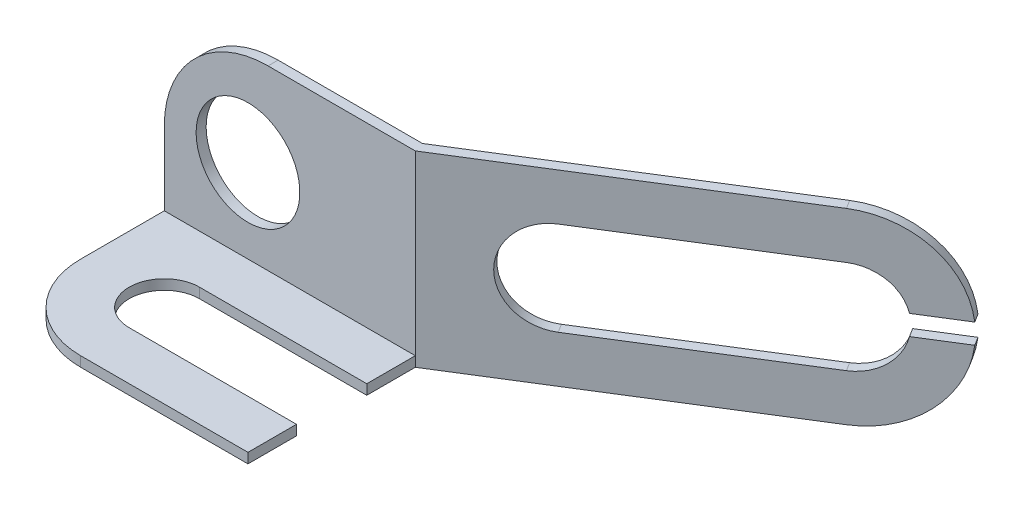
ISO-10303-21;
HEADER;
FILE_DESCRIPTION(('STEP AP214'),'2;1');
FILE_NAME('part.step','',(''),(''),'','','');
FILE_SCHEMA(('AUTOMOTIVE_DESIGN { 1 0 10303 214 1 1 1 1 }'));
ENDSEC;
DATA;
#1=APPLICATION_CONTEXT('core data for automotive mechanical design processes');
#2=APPLICATION_PROTOCOL_DEFINITION('international standard','automotive_design',2000,#1);
#3=PRODUCT_CONTEXT('',#1,'mechanical');
#4=PRODUCT('Part','Part','',(#3));
#5=PRODUCT_RELATED_PRODUCT_CATEGORY('part','',(#4));
#6=PRODUCT_DEFINITION_FORMATION('','',#4);
#7=PRODUCT_DEFINITION_CONTEXT('part definition',#1,'design');
#8=PRODUCT_DEFINITION('design','',#6,#7);
#9=PRODUCT_DEFINITION_SHAPE('','',#8);
#10=(LENGTH_UNIT() NAMED_UNIT(*) SI_UNIT(.MILLI.,.METRE.));
#11=(NAMED_UNIT(*) PLANE_ANGLE_UNIT() SI_UNIT($,.RADIAN.));
#12=(NAMED_UNIT(*) SI_UNIT($,.STERADIAN.) SOLID_ANGLE_UNIT());
#13=UNCERTAINTY_MEASURE_WITH_UNIT(LENGTH_MEASURE(1.E-05),#10,'distance_accuracy_value','');
#14=(GEOMETRIC_REPRESENTATION_CONTEXT(3) GLOBAL_UNCERTAINTY_ASSIGNED_CONTEXT((#13)) GLOBAL_UNIT_ASSIGNED_CONTEXT((#10,
#11,#12)) REPRESENTATION_CONTEXT('',''));
#15=CARTESIAN_POINT('',(0.,0.,0.));
#16=DIRECTION('',(0.,0.,1.));
#17=DIRECTION('',(1.,0.,0.));
#18=AXIS2_PLACEMENT_3D('',#15,#16,#17);
#19=CARTESIAN_POINT('',(0.75,0.06,-0.5));
#20=DIRECTION('',(-1.,0.,0.));
#21=DIRECTION('',(0.,0.,1.));
#22=AXIS2_PLACEMENT_3D('',#19,#20,#21);
#23=PLANE('',#22);
#24=DIRECTION('',(0.,1.,0.));
#25=VECTOR('',#24,1.);
#26=CARTESIAN_POINT('',(0.75,1.12,-0.5));
#27=LINE('',#26,#25);
#28=CARTESIAN_POINT('',(0.75,0.,-0.5));
#29=VERTEX_POINT('',#28);
#30=CARTESIAN_POINT('',(0.75,0.0599999999999999,-0.5));
#31=VERTEX_POINT('',#30);
#32=EDGE_CURVE('E233',#29,#31,#27,.T.);
#33=ORIENTED_EDGE('',*,*,#32,.T.);
#34=DIRECTION('',(0.,0.,-1.));
#35=VECTOR('',#34,1.);
#36=CARTESIAN_POINT('',(0.75,0.06,-0.5));
#37=LINE('',#36,#35);
#38=CARTESIAN_POINT('',(0.75,0.06,-0.21));
#39=VERTEX_POINT('',#38);
#40=EDGE_CURVE('E320',#39,#31,#37,.T.);
#41=ORIENTED_EDGE('',*,*,#40,.F.);
#42=DIRECTION('',(0.,-1.,0.));
#43=VECTOR('',#42,1.);
#44=CARTESIAN_POINT('',(0.75,0.06,-0.21));
#45=LINE('',#44,#43);
#46=CARTESIAN_POINT('',(0.75,0.,-0.21));
#47=VERTEX_POINT('',#46);
#48=EDGE_CURVE('E354',#39,#47,#45,.T.);
#49=ORIENTED_EDGE('',*,*,#48,.T.);
#50=DIRECTION('',(0.,0.,-1.));
#51=VECTOR('',#50,1.);
#52=CARTESIAN_POINT('',(0.75,0.,-0.5));
#53=LINE('',#52,#51);
#54=EDGE_CURVE('E51',#47,#29,#53,.T.);
#55=ORIENTED_EDGE('',*,*,#54,.T.);
#56=EDGE_LOOP('',(#33,#41,#49,#55));
#57=FACE_BOUND('',#56,.T.);
#58=ADVANCED_FACE('F36',(#57),#23,.F.);
#59=CARTESIAN_POINT('',(0.75,0.06,0.21));
#60=DIRECTION('',(-1.,0.,0.));
#61=DIRECTION('',(0.,0.,1.));
#62=AXIS2_PLACEMENT_3D('',#59,#60,#61);
#63=PLANE('',#62);
#64=DIRECTION('',(0.,0.,-1.));
#65=VECTOR('',#64,1.);
#66=CARTESIAN_POINT('',(0.75,0.,0.21));
#67=LINE('',#66,#65);
#68=CARTESIAN_POINT('',(0.75,0.,0.5));
#69=VERTEX_POINT('',#68);
#70=CARTESIAN_POINT('',(0.75,0.,0.21));
#71=VERTEX_POINT('',#70);
#72=EDGE_CURVE('E309',#69,#71,#67,.T.);
#73=ORIENTED_EDGE('',*,*,#72,.T.);
#74=DIRECTION('',(0.,-1.,0.));
#75=VECTOR('',#74,1.);
#76=CARTESIAN_POINT('',(0.75,0.06,0.21));
#77=LINE('',#76,#75);
#78=CARTESIAN_POINT('',(0.75,0.06,0.21));
#79=VERTEX_POINT('',#78);
#80=EDGE_CURVE('E11',#79,#71,#77,.T.);
#81=ORIENTED_EDGE('',*,*,#80,.F.);
#82=DIRECTION('',(0.,0.,-1.));
#83=VECTOR('',#82,1.);
#84=CARTESIAN_POINT('',(0.75,0.06,0.21));
#85=LINE('',#84,#83);
#86=CARTESIAN_POINT('',(0.75,0.06,0.5));
#87=VERTEX_POINT('',#86);
#88=EDGE_CURVE('E310',#87,#79,#85,.T.);
#89=ORIENTED_EDGE('',*,*,#88,.F.);
#90=DIRECTION('',(0.,-1.,0.));
#91=VECTOR('',#90,1.);
#92=CARTESIAN_POINT('',(0.75,0.06,0.5));
#93=LINE('',#92,#91);
#94=EDGE_CURVE('E331',#87,#69,#93,.T.);
#95=ORIENTED_EDGE('',*,*,#94,.T.);
#96=EDGE_LOOP('',(#73,#81,#89,#95));
#97=FACE_BOUND('',#96,.T.);
#98=ADVANCED_FACE('F38',(#97),#63,.F.);
#99=CARTESIAN_POINT('',(-0.25,0.06,0.21));
#100=DIRECTION('',(0.,0.,1.));
#101=DIRECTION('',(1.,0.,0.));
#102=AXIS2_PLACEMENT_3D('',#99,#100,#101);
#103=PLANE('',#102);
#104=DIRECTION('',(-1.,0.,0.));
#105=VECTOR('',#104,1.);
#106=CARTESIAN_POINT('',(-0.25,0.,0.21));
#107=LINE('',#106,#105);
#108=CARTESIAN_POINT('',(-0.25,0.,0.21));
#109=VERTEX_POINT('',#108);
#110=EDGE_CURVE('E334',#71,#109,#107,.T.);
#111=ORIENTED_EDGE('',*,*,#110,.T.);
#112=DIRECTION('',(0.,-1.,0.));
#113=VECTOR('',#112,1.);
#114=CARTESIAN_POINT('',(-0.25,0.06,0.21));
#115=LINE('',#114,#113);
#116=CARTESIAN_POINT('',(-0.25,0.06,0.21));
#117=VERTEX_POINT('',#116);
#118=EDGE_CURVE('E44',#117,#109,#115,.T.);
#119=ORIENTED_EDGE('',*,*,#118,.F.);
#120=DIRECTION('',(-1.,0.,0.));
#121=VECTOR('',#120,1.);
#122=CARTESIAN_POINT('',(-0.25,0.06,0.21));
#123=LINE('',#122,#121);
#124=EDGE_CURVE('E313',#79,#117,#123,.T.);
#125=ORIENTED_EDGE('',*,*,#124,.F.);
#126=ORIENTED_EDGE('',*,*,#80,.T.);
#127=EDGE_LOOP('',(#111,#119,#125,#126));
#128=FACE_BOUND('',#127,.T.);
#129=ADVANCED_FACE('F411',(#128),#103,.F.);
#130=CARTESIAN_POINT('',(-0.25,0.06,0.));
#131=DIRECTION('',(0.,-1.,0.));
#132=DIRECTION('',(0.,0.,-1.));
#133=AXIS2_PLACEMENT_3D('',#130,#131,#132);
#134=CYLINDRICAL_SURFACE('',#133,0.21);
#135=CARTESIAN_POINT('',(-0.25,0.,0.));
#136=DIRECTION('',(0.,-1.,0.));
#137=DIRECTION('',(0.,0.,1.));
#138=AXIS2_PLACEMENT_3D('',#135,#136,#137);
#139=CIRCLE('',#138,0.21);
#140=CARTESIAN_POINT('',(-0.25,0.,-0.21));
#141=VERTEX_POINT('',#140);
#142=EDGE_CURVE('E336',#109,#141,#139,.T.);
#143=ORIENTED_EDGE('',*,*,#142,.T.);
#144=DIRECTION('',(0.,-1.,0.));
#145=VECTOR('',#144,1.);
#146=CARTESIAN_POINT('',(-0.25,0.06,-0.21));
#147=LINE('',#146,#145);
#148=CARTESIAN_POINT('',(-0.25,0.06,-0.21));
#149=VERTEX_POINT('',#148);
#150=EDGE_CURVE('E356',#149,#141,#147,.T.);
#151=ORIENTED_EDGE('',*,*,#150,.F.);
#152=CARTESIAN_POINT('',(-0.25,0.06,0.));
#153=DIRECTION('',(0.,-1.,0.));
#154=DIRECTION('',(0.,0.,1.));
#155=AXIS2_PLACEMENT_3D('',#152,#153,#154);
#156=CIRCLE('',#155,0.21);
#157=EDGE_CURVE('E316',#117,#149,#156,.T.);
#158=ORIENTED_EDGE('',*,*,#157,.F.);
#159=ORIENTED_EDGE('',*,*,#118,.T.);
#160=EDGE_LOOP('',(#143,#151,#158,#159));
#161=FACE_BOUND('',#160,.T.);
#162=ADVANCED_FACE('F363',(#161),#134,.F.);
#163=CARTESIAN_POINT('',(-0.25,0.06,-0.21));
#164=DIRECTION('',(0.,0.,-1.));
#165=DIRECTION('',(-1.,0.,0.));
#166=AXIS2_PLACEMENT_3D('',#163,#164,#165);
#167=PLANE('',#166);
#168=DIRECTION('',(1.,0.,0.));
#169=VECTOR('',#168,1.);
#170=CARTESIAN_POINT('',(-0.25,0.,-0.21));
#171=LINE('',#170,#169);
#172=EDGE_CURVE('E338',#141,#47,#171,.T.);
#173=ORIENTED_EDGE('',*,*,#172,.T.);
#174=ORIENTED_EDGE('',*,*,#48,.F.);
#175=DIRECTION('',(1.,0.,0.));
#176=VECTOR('',#175,1.);
#177=CARTESIAN_POINT('',(-0.25,0.06,-0.21));
#178=LINE('',#177,#176);
#179=EDGE_CURVE('E318',#149,#39,#178,.T.);
#180=ORIENTED_EDGE('',*,*,#179,.F.);
#181=ORIENTED_EDGE('',*,*,#150,.T.);
#182=EDGE_LOOP('',(#173,#174,#180,#181));
#183=FACE_BOUND('',#182,.T.);
#184=ADVANCED_FACE('F372',(#183),#167,.F.);
#185=CARTESIAN_POINT('',(-0.75,0.06,-0.5));
#186=DIRECTION('',(1.,0.,0.));
#187=DIRECTION('',(0.,0.,-1.));
#188=AXIS2_PLACEMENT_3D('',#185,#186,#187);
#189=PLANE('',#188);
#190=DIRECTION('',(0.,0.,1.));
#191=VECTOR('',#190,1.);
#192=CARTESIAN_POINT('',(-0.75,0.,-0.5));
#193=LINE('',#192,#191);
#194=CARTESIAN_POINT('',(-0.75,0.,-0.56));
#195=VERTEX_POINT('',#194);
#196=CARTESIAN_POINT('',(-0.75,0.,0.));
#197=VERTEX_POINT('',#196);
#198=EDGE_CURVE('E341',#195,#197,#193,.T.);
#199=ORIENTED_EDGE('',*,*,#198,.T.);
#200=DIRECTION('',(0.,-1.,0.));
#201=VECTOR('',#200,1.);
#202=CARTESIAN_POINT('',(-0.75,0.06,0.));
#203=LINE('',#202,#201);
#204=CARTESIAN_POINT('',(-0.75,0.06,0.));
#205=VERTEX_POINT('',#204);
#206=EDGE_CURVE('E351',#205,#197,#203,.T.);
#207=ORIENTED_EDGE('',*,*,#206,.F.);
#208=DIRECTION('',(0.,0.,1.));
#209=VECTOR('',#208,1.);
#210=CARTESIAN_POINT('',(-0.75,0.06,-0.5));
#211=LINE('',#210,#209);
#212=CARTESIAN_POINT('',(-0.75,0.06,-0.5));
#213=VERTEX_POINT('',#212);
#214=EDGE_CURVE('E325',#213,#205,#211,.T.);
#215=ORIENTED_EDGE('',*,*,#214,.F.);
#216=DIRECTION('',(0.,1.,0.));
#217=VECTOR('',#216,1.);
#218=CARTESIAN_POINT('',(-0.75,0.,-0.5));
#219=LINE('',#218,#217);
#220=CARTESIAN_POINT('',(-0.75,0.499999999999996,-0.5));
#221=VERTEX_POINT('',#220);
#222=EDGE_CURVE('E299',#213,#221,#219,.T.);
#223=ORIENTED_EDGE('',*,*,#222,.T.);
#224=DIRECTION('',(0.,0.,1.));
#225=VECTOR('',#224,1.);
#226=CARTESIAN_POINT('',(-0.75,0.499999999999996,-0.56));
#227=LINE('',#226,#225);
#228=CARTESIAN_POINT('',(-0.75,0.499999999999996,-0.56));
#229=VERTEX_POINT('',#228);
#230=EDGE_CURVE('E306',#229,#221,#227,.T.);
#231=ORIENTED_EDGE('',*,*,#230,.F.);
#232=DIRECTION('',(0.,1.,0.));
#233=VECTOR('',#232,1.);
#234=CARTESIAN_POINT('',(-0.75,0.,-0.56));
#235=LINE('',#234,#233);
#236=EDGE_CURVE('E289',#195,#229,#235,.T.);
#237=ORIENTED_EDGE('',*,*,#236,.F.);
#238=EDGE_LOOP('',(#199,#207,#215,#223,#231,#237));
#239=FACE_BOUND('',#238,.T.);
#240=ADVANCED_FACE('F388',(#239),#189,.F.);
#241=CARTESIAN_POINT('',(-0.25,0.06,0.));
#242=DIRECTION('',(0.,-1.,0.));
#243=DIRECTION('',(0.,0.,-1.));
#244=AXIS2_PLACEMENT_3D('',#241,#242,#243);
#245=CYLINDRICAL_SURFACE('',#244,0.5);
#246=CARTESIAN_POINT('',(-0.25,0.,0.));
#247=DIRECTION('',(0.,1.,0.));
#248=DIRECTION('',(0.,0.,-1.));
#249=AXIS2_PLACEMENT_3D('',#246,#247,#248);
#250=CIRCLE('',#249,0.5);
#251=CARTESIAN_POINT('',(-0.249999999999997,0.,0.5));
#252=VERTEX_POINT('',#251);
#253=EDGE_CURVE('E343',#197,#252,#250,.T.);
#254=ORIENTED_EDGE('',*,*,#253,.T.);
#255=DIRECTION('',(0.,-1.,0.));
#256=VECTOR('',#255,1.);
#257=CARTESIAN_POINT('',(-0.249999999999997,0.06,0.5));
#258=LINE('',#257,#256);
#259=CARTESIAN_POINT('',(-0.249999999999997,0.06,0.5));
#260=VERTEX_POINT('',#259);
#261=EDGE_CURVE('E348',#260,#252,#258,.T.);
#262=ORIENTED_EDGE('',*,*,#261,.F.);
#263=CARTESIAN_POINT('',(-0.25,0.06,0.));
#264=DIRECTION('',(0.,1.,0.));
#265=DIRECTION('',(0.,0.,-1.));
#266=AXIS2_PLACEMENT_3D('',#263,#264,#265);
#267=CIRCLE('',#266,0.5);
#268=EDGE_CURVE('E327',#205,#260,#267,.T.);
#269=ORIENTED_EDGE('',*,*,#268,.F.);
#270=ORIENTED_EDGE('',*,*,#206,.T.);
#271=EDGE_LOOP('',(#254,#262,#269,#270));
#272=FACE_BOUND('',#271,.T.);
#273=ADVANCED_FACE('F401',(#272),#245,.T.);
#274=CARTESIAN_POINT('',(-0.249999999999997,0.06,0.5));
#275=DIRECTION('',(0.,0.,-1.));
#276=DIRECTION('',(-1.,0.,0.));
#277=AXIS2_PLACEMENT_3D('',#274,#275,#276);
#278=PLANE('',#277);
#279=DIRECTION('',(1.,0.,0.));
#280=VECTOR('',#279,1.);
#281=CARTESIAN_POINT('',(-0.249999999999997,0.,0.5));
#282=LINE('',#281,#280);
#283=EDGE_CURVE('E314',#252,#69,#282,.T.);
#284=ORIENTED_EDGE('',*,*,#283,.T.);
#285=ORIENTED_EDGE('',*,*,#94,.F.);
#286=DIRECTION('',(1.,0.,0.));
#287=VECTOR('',#286,1.);
#288=CARTESIAN_POINT('',(-0.249999999999997,0.06,0.5));
#289=LINE('',#288,#287);
#290=EDGE_CURVE('E329',#260,#87,#289,.T.);
#291=ORIENTED_EDGE('',*,*,#290,.F.);
#292=ORIENTED_EDGE('',*,*,#261,.T.);
#293=EDGE_LOOP('',(#284,#285,#291,#292));
#294=FACE_BOUND('',#293,.T.);
#295=ADVANCED_FACE('F406',(#294),#278,.F.);
#296=CARTESIAN_POINT('',(-0.25,0.06,0.));
#297=DIRECTION('',(0.,-1.,0.));
#298=DIRECTION('',(0.,0.,-1.));
#299=AXIS2_PLACEMENT_3D('',#296,#297,#298);
#300=PLANE('',#299);
#301=ORIENTED_EDGE('',*,*,#88,.T.);
#302=ORIENTED_EDGE('',*,*,#124,.T.);
#303=ORIENTED_EDGE('',*,*,#157,.T.);
#304=ORIENTED_EDGE('',*,*,#179,.T.);
#305=ORIENTED_EDGE('',*,*,#40,.T.);
#306=DIRECTION('',(-1.,0.,0.));
#307=VECTOR('',#306,1.);
#308=CARTESIAN_POINT('',(-0.75,0.06,-0.5));
#309=LINE('',#308,#307);
#310=EDGE_CURVE('E322',#31,#213,#309,.T.);
#311=ORIENTED_EDGE('',*,*,#310,.T.);
#312=ORIENTED_EDGE('',*,*,#214,.T.);
#313=ORIENTED_EDGE('',*,*,#268,.T.);
#314=ORIENTED_EDGE('',*,*,#290,.T.);
#315=EDGE_LOOP('',(#301,#302,#303,#304,#305,#311,#312,#313,#314));
#316=FACE_BOUND('',#315,.T.);
#317=ADVANCED_FACE('F378',(#316),#300,.F.);
#318=CARTESIAN_POINT('',(-0.25,0.,0.));
#319=DIRECTION('',(0.,-1.,0.));
#320=DIRECTION('',(0.,0.,-1.));
#321=AXIS2_PLACEMENT_3D('',#318,#319,#320);
#322=PLANE('',#321);
#323=DIRECTION('',(-0.848048096156425,0.,0.529919264233206));
#324=VECTOR('',#323,1.);
#325=CARTESIAN_POINT('',(0.75,0.,-0.5));
#326=LINE('',#325,#324);
#327=CARTESIAN_POINT('',(2.33584993981252,0.,-1.4909490241161));
#328=VERTEX_POINT('',#327);
#329=EDGE_CURVE('E198',#328,#29,#326,.T.);
#330=ORIENTED_EDGE('',*,*,#329,.T.);
#331=ORIENTED_EDGE('',*,*,#54,.F.);
#332=ORIENTED_EDGE('',*,*,#172,.F.);
#333=ORIENTED_EDGE('',*,*,#142,.F.);
#334=ORIENTED_EDGE('',*,*,#110,.F.);
#335=ORIENTED_EDGE('',*,*,#72,.F.);
#336=ORIENTED_EDGE('',*,*,#283,.F.);
#337=ORIENTED_EDGE('',*,*,#253,.F.);
#338=ORIENTED_EDGE('',*,*,#198,.F.);
#339=DIRECTION('',(-1.,0.,0.));
#340=VECTOR('',#339,1.);
#341=CARTESIAN_POINT('',(0.75,0.,-0.56));
#342=LINE('',#341,#340);
#343=CARTESIAN_POINT('',(0.732795276854471,0.,-0.56));
#344=VERTEX_POINT('',#343);
#345=EDGE_CURVE('E287',#344,#195,#342,.T.);
#346=ORIENTED_EDGE('',*,*,#345,.F.);
#347=DIRECTION('',(-0.848048096156425,0.,0.529919264233206));
#348=VECTOR('',#347,1.);
#349=CARTESIAN_POINT('',(0.718204844146007,0.,-0.550882885769386));
#350=LINE('',#349,#348);
#351=CARTESIAN_POINT('',(2.30405478395852,0.,-1.54183190988548));
#352=VERTEX_POINT('',#351);
#353=EDGE_CURVE('E230',#352,#344,#350,.T.);
#354=ORIENTED_EDGE('',*,*,#353,.F.);
#355=DIRECTION('',(0.529919264233206,0.,0.848048096156425));
#356=VECTOR('',#355,1.);
#357=CARTESIAN_POINT('',(2.30405478395852,0.,-1.54183190988548));
#358=LINE('',#357,#356);
#359=EDGE_CURVE('E232',#352,#328,#358,.T.);
#360=ORIENTED_EDGE('',*,*,#359,.T.);
#361=EDGE_LOOP('',(#330,#331,#332,#333,#334,#335,#336,#337,#338,#346,#354,#360));
#362=FACE_BOUND('',#361,.T.);
#363=ADVANCED_FACE('F368',(#362),#322,.T.);
#364=CARTESIAN_POINT('',(-0.13,0.5,-0.56));
#365=DIRECTION('',(0.,0.,-1.));
#366=DIRECTION('',(-1.,0.,0.));
#367=AXIS2_PLACEMENT_3D('',#364,#365,#366);
#368=PLANE('',#367);
#369=DIRECTION('',(0.,1.,0.));
#370=VECTOR('',#369,1.);
#371=CARTESIAN_POINT('',(0.732795276854471,0.5,-0.56));
#372=LINE('',#371,#370);
#373=CARTESIAN_POINT('',(0.732795276854471,1.12,-0.56));
#374=VERTEX_POINT('',#373);
#375=EDGE_CURVE('E59',#344,#374,#372,.T.);
#376=ORIENTED_EDGE('',*,*,#375,.F.);
#377=ORIENTED_EDGE('',*,*,#345,.T.);
#378=ORIENTED_EDGE('',*,*,#236,.T.);
#379=CARTESIAN_POINT('',(-0.13,0.5,-0.56));
#380=DIRECTION('',(0.,0.,-1.));
#381=DIRECTION('',(-1.,0.,0.));
#382=AXIS2_PLACEMENT_3D('',#379,#380,#381);
#383=CIRCLE('',#382,0.62);
#384=CARTESIAN_POINT('',(-0.129999999999996,1.12,-0.56));
#385=VERTEX_POINT('',#384);
#386=EDGE_CURVE('E292',#229,#385,#383,.T.);
#387=ORIENTED_EDGE('',*,*,#386,.T.);
#388=DIRECTION('',(1.,0.,0.));
#389=VECTOR('',#388,1.);
#390=CARTESIAN_POINT('',(0.75,1.12,-0.56));
#391=LINE('',#390,#389);
#392=EDGE_CURVE('E294',#385,#374,#391,.T.);
#393=ORIENTED_EDGE('',*,*,#392,.T.);
#394=EDGE_LOOP('',(#376,#377,#378,#387,#393));
#395=FACE_BOUND('',#394,.T.);
#396=CARTESIAN_POINT('',(-0.25,0.56,-0.56));
#397=DIRECTION('',(0.,0.,-1.));
#398=DIRECTION('',(-1.,0.,0.));
#399=AXIS2_PLACEMENT_3D('',#396,#397,#398);
#400=CIRCLE('',#399,0.31);
#401=CARTESIAN_POINT('',(-0.56,0.56,-0.56));
#402=VERTEX_POINT('',#401);
#403=EDGE_CURVE('E281',#402,#402,#400,.T.);
#404=ORIENTED_EDGE('',*,*,#403,.F.);
#405=EDGE_LOOP('',(#404));
#406=FACE_BOUND('',#405,.T.);
#407=ADVANCED_FACE('F395',(#395,#406),#368,.T.);
#408=CARTESIAN_POINT('',(-0.13,0.5,-0.5));
#409=DIRECTION('',(0.,0.,-1.));
#410=DIRECTION('',(-1.,0.,0.));
#411=AXIS2_PLACEMENT_3D('',#408,#409,#410);
#412=PLANE('',#411);
#413=ORIENTED_EDGE('',*,*,#310,.F.);
#414=DIRECTION('',(0.,-1.,0.));
#415=VECTOR('',#414,1.);
#416=CARTESIAN_POINT('',(0.75,0.,-0.5));
#417=LINE('',#416,#415);
#418=CARTESIAN_POINT('',(0.75,1.12,-0.5));
#419=VERTEX_POINT('',#418);
#420=EDGE_CURVE('E284',#419,#31,#417,.T.);
#421=ORIENTED_EDGE('',*,*,#420,.F.);
#422=DIRECTION('',(1.,0.,0.));
#423=VECTOR('',#422,1.);
#424=CARTESIAN_POINT('',(0.75,1.12,-0.5));
#425=LINE('',#424,#423);
#426=CARTESIAN_POINT('',(-0.129999999999996,1.12,-0.5));
#427=VERTEX_POINT('',#426);
#428=EDGE_CURVE('E290',#427,#419,#425,.T.);
#429=ORIENTED_EDGE('',*,*,#428,.F.);
#430=CARTESIAN_POINT('',(-0.13,0.5,-0.5));
#431=DIRECTION('',(0.,0.,-1.));
#432=DIRECTION('',(-1.,0.,0.));
#433=AXIS2_PLACEMENT_3D('',#430,#431,#432);
#434=CIRCLE('',#433,0.62);
#435=EDGE_CURVE('E301',#221,#427,#434,.T.);
#436=ORIENTED_EDGE('',*,*,#435,.F.);
#437=ORIENTED_EDGE('',*,*,#222,.F.);
#438=EDGE_LOOP('',(#413,#421,#429,#436,#437));
#439=FACE_BOUND('',#438,.T.);
#440=CARTESIAN_POINT('',(-0.25,0.56,-0.5));
#441=DIRECTION('',(0.,0.,-1.));
#442=DIRECTION('',(-1.,0.,0.));
#443=AXIS2_PLACEMENT_3D('',#440,#441,#442);
#444=CIRCLE('',#443,0.31);
#445=CARTESIAN_POINT('',(-0.56,0.56,-0.5));
#446=VERTEX_POINT('',#445);
#447=EDGE_CURVE('E280',#446,#446,#444,.T.);
#448=ORIENTED_EDGE('',*,*,#447,.T.);
#449=EDGE_LOOP('',(#448));
#450=FACE_BOUND('',#449,.T.);
#451=ADVANCED_FACE('F382',(#439,#450),#412,.F.);
#452=CARTESIAN_POINT('',(-0.13,0.5,-0.56));
#453=DIRECTION('',(0.,0.,1.));
#454=DIRECTION('',(1.,0.,0.));
#455=AXIS2_PLACEMENT_3D('',#452,#453,#454);
#456=CYLINDRICAL_SURFACE('',#455,0.62);
#457=ORIENTED_EDGE('',*,*,#435,.T.);
#458=DIRECTION('',(0.,0.,1.));
#459=VECTOR('',#458,1.);
#460=CARTESIAN_POINT('',(-0.129999999999996,1.12,-0.56));
#461=LINE('',#460,#459);
#462=EDGE_CURVE('E296',#385,#427,#461,.T.);
#463=ORIENTED_EDGE('',*,*,#462,.F.);
#464=ORIENTED_EDGE('',*,*,#386,.F.);
#465=ORIENTED_EDGE('',*,*,#230,.T.);
#466=EDGE_LOOP('',(#457,#463,#464,#465));
#467=FACE_BOUND('',#466,.T.);
#468=ADVANCED_FACE('F393',(#467),#456,.T.);
#469=CARTESIAN_POINT('',(0.75,1.12,-0.56));
#470=DIRECTION('',(0.,-1.,0.));
#471=DIRECTION('',(0.,0.,-1.));
#472=AXIS2_PLACEMENT_3D('',#469,#470,#471);
#473=PLANE('',#472);
#474=ORIENTED_EDGE('',*,*,#428,.T.);
#475=DIRECTION('',(0.848048096156425,0.,-0.529919264233206));
#476=VECTOR('',#475,1.);
#477=CARTESIAN_POINT('',(0.75,1.12,-0.5));
#478=LINE('',#477,#476);
#479=CARTESIAN_POINT('',(2.33584993981252,1.12,-1.4909490241161));
#480=VERTEX_POINT('',#479);
#481=EDGE_CURVE('E204',#419,#480,#478,.T.);
#482=ORIENTED_EDGE('',*,*,#481,.T.);
#483=DIRECTION('',(0.529919264233206,0.,0.848048096156425));
#484=VECTOR('',#483,1.);
#485=CARTESIAN_POINT('',(2.30405478395852,1.12,-1.54183190988548));
#486=LINE('',#485,#484);
#487=CARTESIAN_POINT('',(2.30405478395852,1.12,-1.54183190988548));
#488=VERTEX_POINT('',#487);
#489=EDGE_CURVE('E201',#488,#480,#486,.T.);
#490=ORIENTED_EDGE('',*,*,#489,.F.);
#491=DIRECTION('',(0.848048096156425,0.,-0.529919264233206));
#492=VECTOR('',#491,1.);
#493=CARTESIAN_POINT('',(0.718204844146007,1.12,-0.550882885769386));
#494=LINE('',#493,#492);
#495=EDGE_CURVE('E189',#374,#488,#494,.T.);
#496=ORIENTED_EDGE('',*,*,#495,.F.);
#497=ORIENTED_EDGE('',*,*,#392,.F.);
#498=ORIENTED_EDGE('',*,*,#462,.T.);
#499=EDGE_LOOP('',(#474,#482,#490,#496,#497,#498));
#500=FACE_BOUND('',#499,.T.);
#501=ADVANCED_FACE('F202',(#500),#473,.F.);
#502=CARTESIAN_POINT('',(-0.25,0.56,-0.56));
#503=DIRECTION('',(0.,0.,1.));
#504=DIRECTION('',(1.,0.,0.));
#505=AXIS2_PLACEMENT_3D('',#502,#503,#504);
#506=CYLINDRICAL_SURFACE('',#505,0.31);
#507=ORIENTED_EDGE('',*,*,#403,.T.);
#508=EDGE_LOOP('',(#507));
#509=FACE_BOUND('',#508,.T.);
#510=ORIENTED_EDGE('',*,*,#447,.F.);
#511=EDGE_LOOP('',(#510));
#512=FACE_BOUND('',#511,.T.);
#513=ADVANCED_FACE('F445',(#509,#512),#506,.F.);
#514=CARTESIAN_POINT('',(2.30405478395852,0.56,-1.54183190988548));
#515=DIRECTION('',(0.529919264233206,0.,0.848048096156425));
#516=DIRECTION('',(0.848048096156425,0.,-0.529919264233206));
#517=AXIS2_PLACEMENT_3D('',#514,#515,#516);
#518=CYLINDRICAL_SURFACE('',#517,0.56);
#519=CARTESIAN_POINT('',(2.33584993981252,0.56,-1.4909490241161));
#520=DIRECTION('',(-0.529919264233206,0.,-0.848048096156425));
#521=DIRECTION('',(-0.848048096156425,0.,0.529919264233206));
#522=AXIS2_PLACEMENT_3D('',#519,#520,#521);
#523=CIRCLE('',#522,0.56);
#524=CARTESIAN_POINT('',(2.80802313658707,0.62,-1.78599558357357));
#525=VERTEX_POINT('',#524);
#526=EDGE_CURVE('E236',#480,#525,#523,.T.);
#527=ORIENTED_EDGE('',*,*,#526,.T.);
#528=DIRECTION('',(0.529919264233206,0.,0.848048096156425));
#529=VECTOR('',#528,1.);
#530=CARTESIAN_POINT('',(2.77622798073308,0.62,-1.83687846934296));
#531=LINE('',#530,#529);
#532=CARTESIAN_POINT('',(2.77622798073308,0.62,-1.83687846934296));
#533=VERTEX_POINT('',#532);
#534=EDGE_CURVE('E207',#533,#525,#531,.T.);
#535=ORIENTED_EDGE('',*,*,#534,.F.);
#536=CARTESIAN_POINT('',(2.30405478395852,0.56,-1.54183190988548));
#537=DIRECTION('',(-0.529919264233206,0.,-0.848048096156425));
#538=DIRECTION('',(-0.848048096156425,0.,0.529919264233206));
#539=AXIS2_PLACEMENT_3D('',#536,#537,#538);
#540=CIRCLE('',#539,0.56);
#541=EDGE_CURVE('E194',#488,#533,#540,.T.);
#542=ORIENTED_EDGE('',*,*,#541,.F.);
#543=ORIENTED_EDGE('',*,*,#489,.T.);
#544=EDGE_LOOP('',(#527,#535,#542,#543));
#545=FACE_BOUND('',#544,.T.);
#546=ADVANCED_FACE('F209',(#545),#518,.T.);
#547=CARTESIAN_POINT('',(2.53599244991623,0.62,-1.68676264889584));
#548=DIRECTION('',(0.,1.,0.));
#549=DIRECTION('',(-1.,0.,0.));
#550=AXIS2_PLACEMENT_3D('',#547,#548,#549);
#551=PLANE('',#550);
#552=DIRECTION('',(-0.848048096156426,0.,0.529919264233205));
#553=VECTOR('',#552,1.);
#554=CARTESIAN_POINT('',(2.56778760577023,0.62,-1.63587976312645));
#555=LINE('',#554,#553);
#556=CARTESIAN_POINT('',(2.56778760577023,0.62,-1.63587976312645));
#557=VERTEX_POINT('',#556);
#558=EDGE_CURVE('E238',#525,#557,#555,.T.);
#559=ORIENTED_EDGE('',*,*,#558,.T.);
#560=DIRECTION('',(0.529919264233206,0.,0.848048096156425));
#561=VECTOR('',#560,1.);
#562=CARTESIAN_POINT('',(2.53599244991623,0.62,-1.68676264889584));
#563=LINE('',#562,#561);
#564=CARTESIAN_POINT('',(2.53599244991623,0.62,-1.68676264889584));
#565=VERTEX_POINT('',#564);
#566=EDGE_CURVE('E275',#565,#557,#563,.T.);
#567=ORIENTED_EDGE('',*,*,#566,.F.);
#568=DIRECTION('',(-0.848048096156426,0.,0.529919264233205));
#569=VECTOR('',#568,1.);
#570=CARTESIAN_POINT('',(2.53599244991623,0.62,-1.68676264889584));
#571=LINE('',#570,#569);
#572=EDGE_CURVE('E212',#533,#565,#571,.T.);
#573=ORIENTED_EDGE('',*,*,#572,.F.);
#574=ORIENTED_EDGE('',*,*,#534,.T.);
#575=EDGE_LOOP('',(#559,#567,#573,#574));
#576=FACE_BOUND('',#575,.T.);
#577=ADVANCED_FACE('F455',(#576),#551,.F.);
#578=CARTESIAN_POINT('',(2.30405478395852,0.56,-1.54183190988548));
#579=DIRECTION('',(0.529919264233206,0.,0.848048096156425));
#580=DIRECTION('',(0.848048096156425,0.,-0.529919264233206));
#581=AXIS2_PLACEMENT_3D('',#578,#579,#580);
#582=CYLINDRICAL_SURFACE('',#581,0.28);
#583=CARTESIAN_POINT('',(2.33584993981252,0.56,-1.4909490241161));
#584=DIRECTION('',(0.529919264233206,0.,0.848048096156425));
#585=DIRECTION('',(-0.848048096156425,0.,0.529919264233206));
#586=AXIS2_PLACEMENT_3D('',#583,#584,#585);
#587=CIRCLE('',#586,0.28);
#588=CARTESIAN_POINT('',(2.33584993981252,0.84,-1.4909490241161));
#589=VERTEX_POINT('',#588);
#590=EDGE_CURVE('E240',#557,#589,#587,.T.);
#591=ORIENTED_EDGE('',*,*,#590,.T.);
#592=DIRECTION('',(0.529919264233206,0.,0.848048096156425));
#593=VECTOR('',#592,1.);
#594=CARTESIAN_POINT('',(2.30405478395852,0.84,-1.54183190988548));
#595=LINE('',#594,#593);
#596=CARTESIAN_POINT('',(2.30405478395852,0.84,-1.54183190988548));
#597=VERTEX_POINT('',#596);
#598=EDGE_CURVE('E272',#597,#589,#595,.T.);
#599=ORIENTED_EDGE('',*,*,#598,.F.);
#600=CARTESIAN_POINT('',(2.30405478395852,0.56,-1.54183190988548));
#601=DIRECTION('',(0.529919264233206,0.,0.848048096156425));
#602=DIRECTION('',(-0.848048096156425,0.,0.529919264233206));
#603=AXIS2_PLACEMENT_3D('',#600,#601,#602);
#604=CIRCLE('',#603,0.28);
#605=EDGE_CURVE('E214',#565,#597,#604,.T.);
#606=ORIENTED_EDGE('',*,*,#605,.F.);
#607=ORIENTED_EDGE('',*,*,#566,.T.);
#608=EDGE_LOOP('',(#591,#599,#606,#607));
#609=FACE_BOUND('',#608,.T.);
#610=ADVANCED_FACE('F458',(#609),#582,.F.);
#611=CARTESIAN_POINT('',(1.24399466376299,0.84,-0.879432829593974));
#612=DIRECTION('',(0.,1.,0.));
#613=DIRECTION('',(-1.,0.,0.));
#614=AXIS2_PLACEMENT_3D('',#611,#612,#613);
#615=PLANE('',#614);
#616=DIRECTION('',(-0.848048096156425,0.,0.529919264233206));
#617=VECTOR('',#616,1.);
#618=CARTESIAN_POINT('',(1.27578981961698,0.84,-0.828549943824588));
#619=LINE('',#618,#617);
#620=CARTESIAN_POINT('',(1.27578981961698,0.84,-0.828549943824588));
#621=VERTEX_POINT('',#620);
#622=EDGE_CURVE('E242',#589,#621,#619,.T.);
#623=ORIENTED_EDGE('',*,*,#622,.T.);
#624=DIRECTION('',(0.529919264233206,0.,0.848048096156425));
#625=VECTOR('',#624,1.);
#626=CARTESIAN_POINT('',(1.24399466376299,0.84,-0.879432829593974));
#627=LINE('',#626,#625);
#628=CARTESIAN_POINT('',(1.24399466376299,0.84,-0.879432829593974));
#629=VERTEX_POINT('',#628);
#630=EDGE_CURVE('E269',#629,#621,#627,.T.);
#631=ORIENTED_EDGE('',*,*,#630,.F.);
#632=DIRECTION('',(-0.848048096156425,0.,0.529919264233206));
#633=VECTOR('',#632,1.);
#634=CARTESIAN_POINT('',(1.24399466376299,0.84,-0.879432829593974));
#635=LINE('',#634,#633);
#636=EDGE_CURVE('E218',#597,#629,#635,.T.);
#637=ORIENTED_EDGE('',*,*,#636,.F.);
#638=ORIENTED_EDGE('',*,*,#598,.T.);
#639=EDGE_LOOP('',(#623,#631,#637,#638));
#640=FACE_BOUND('',#639,.T.);
#641=ADVANCED_FACE('F462',(#640),#615,.F.);
#642=CARTESIAN_POINT('',(1.24399466376299,0.56,-0.879432829593974));
#643=DIRECTION('',(0.529919264233206,0.,0.848048096156425));
#644=DIRECTION('',(0.848048096156425,0.,-0.529919264233206));
#645=AXIS2_PLACEMENT_3D('',#642,#643,#644);
#646=CYLINDRICAL_SURFACE('',#645,0.28);
#647=CARTESIAN_POINT('',(1.27578981961698,0.56,-0.828549943824588));
#648=DIRECTION('',(0.529919264233206,0.,0.848048096156425));
#649=DIRECTION('',(-0.848048096156425,0.,0.529919264233206));
#650=AXIS2_PLACEMENT_3D('',#647,#648,#649);
#651=CIRCLE('',#650,0.28);
#652=CARTESIAN_POINT('',(1.27578981961698,0.28,-0.828549943824588));
#653=VERTEX_POINT('',#652);
#654=EDGE_CURVE('E244',#621,#653,#651,.T.);
#655=ORIENTED_EDGE('',*,*,#654,.T.);
#656=DIRECTION('',(0.529919264233206,0.,0.848048096156425));
#657=VECTOR('',#656,1.);
#658=CARTESIAN_POINT('',(1.24399466376299,0.28,-0.879432829593974));
#659=LINE('',#658,#657);
#660=CARTESIAN_POINT('',(1.24399466376299,0.28,-0.879432829593974));
#661=VERTEX_POINT('',#660);
#662=EDGE_CURVE('E266',#661,#653,#659,.T.);
#663=ORIENTED_EDGE('',*,*,#662,.F.);
#664=CARTESIAN_POINT('',(1.24399466376299,0.56,-0.879432829593974));
#665=DIRECTION('',(0.529919264233206,0.,0.848048096156425));
#666=DIRECTION('',(-0.848048096156425,0.,0.529919264233206));
#667=AXIS2_PLACEMENT_3D('',#664,#665,#666);
#668=CIRCLE('',#667,0.28);
#669=EDGE_CURVE('E220',#629,#661,#668,.T.);
#670=ORIENTED_EDGE('',*,*,#669,.F.);
#671=ORIENTED_EDGE('',*,*,#630,.T.);
#672=EDGE_LOOP('',(#655,#663,#670,#671));
#673=FACE_BOUND('',#672,.T.);
#674=ADVANCED_FACE('F466',(#673),#646,.F.);
#675=CARTESIAN_POINT('',(1.24399466376299,0.28,-0.879432829593974));
#676=DIRECTION('',(0.,-1.,0.));
#677=DIRECTION('',(1.,0.,0.));
#678=AXIS2_PLACEMENT_3D('',#675,#676,#677);
#679=PLANE('',#678);
#680=DIRECTION('',(0.848048096156425,0.,-0.529919264233206));
#681=VECTOR('',#680,1.);
#682=CARTESIAN_POINT('',(1.27578981961698,0.28,-0.828549943824588));
#683=LINE('',#682,#681);
#684=CARTESIAN_POINT('',(2.33584993981252,0.28,-1.4909490241161));
#685=VERTEX_POINT('',#684);
#686=EDGE_CURVE('E246',#653,#685,#683,.T.);
#687=ORIENTED_EDGE('',*,*,#686,.T.);
#688=DIRECTION('',(0.529919264233206,0.,0.848048096156425));
#689=VECTOR('',#688,1.);
#690=CARTESIAN_POINT('',(2.30405478395852,0.28,-1.54183190988548));
#691=LINE('',#690,#689);
#692=CARTESIAN_POINT('',(2.30405478395852,0.28,-1.54183190988548));
#693=VERTEX_POINT('',#692);
#694=EDGE_CURVE('E263',#693,#685,#691,.T.);
#695=ORIENTED_EDGE('',*,*,#694,.F.);
#696=DIRECTION('',(0.848048096156425,0.,-0.529919264233206));
#697=VECTOR('',#696,1.);
#698=CARTESIAN_POINT('',(1.24399466376299,0.28,-0.879432829593974));
#699=LINE('',#698,#697);
#700=EDGE_CURVE('E222',#661,#693,#699,.T.);
#701=ORIENTED_EDGE('',*,*,#700,.F.);
#702=ORIENTED_EDGE('',*,*,#662,.T.);
#703=EDGE_LOOP('',(#687,#695,#701,#702));
#704=FACE_BOUND('',#703,.T.);
#705=ADVANCED_FACE('F470',(#704),#679,.F.);
#706=CARTESIAN_POINT('',(2.30405478395852,0.56,-1.54183190988548));
#707=DIRECTION('',(0.529919264233206,0.,0.848048096156425));
#708=DIRECTION('',(0.848048096156425,0.,-0.529919264233206));
#709=AXIS2_PLACEMENT_3D('',#706,#707,#708);
#710=CYLINDRICAL_SURFACE('',#709,0.28);
#711=CARTESIAN_POINT('',(2.33584993981252,0.56,-1.4909490241161));
#712=DIRECTION('',(0.529919264233206,0.,0.848048096156425));
#713=DIRECTION('',(-0.848048096156425,0.,0.529919264233206));
#714=AXIS2_PLACEMENT_3D('',#711,#712,#713);
#715=CIRCLE('',#714,0.28);
#716=CARTESIAN_POINT('',(2.56778760577023,0.5,-1.63587976312645));
#717=VERTEX_POINT('',#716);
#718=EDGE_CURVE('E248',#685,#717,#715,.T.);
#719=ORIENTED_EDGE('',*,*,#718,.T.);
#720=DIRECTION('',(0.529919264233206,0.,0.848048096156425));
#721=VECTOR('',#720,1.);
#722=CARTESIAN_POINT('',(2.53599244991624,0.5,-1.68676264889584));
#723=LINE('',#722,#721);
#724=CARTESIAN_POINT('',(2.53599244991624,0.5,-1.68676264889584));
#725=VERTEX_POINT('',#724);
#726=EDGE_CURVE('E260',#725,#717,#723,.T.);
#727=ORIENTED_EDGE('',*,*,#726,.F.);
#728=CARTESIAN_POINT('',(2.30405478395852,0.56,-1.54183190988548));
#729=DIRECTION('',(0.529919264233206,0.,0.848048096156425));
#730=DIRECTION('',(-0.848048096156425,0.,0.529919264233206));
#731=AXIS2_PLACEMENT_3D('',#728,#729,#730);
#732=CIRCLE('',#731,0.28);
#733=EDGE_CURVE('E224',#693,#725,#732,.T.);
#734=ORIENTED_EDGE('',*,*,#733,.F.);
#735=ORIENTED_EDGE('',*,*,#694,.T.);
#736=EDGE_LOOP('',(#719,#727,#734,#735));
#737=FACE_BOUND('',#736,.T.);
#738=ADVANCED_FACE('F474',(#737),#710,.F.);
#739=CARTESIAN_POINT('',(2.53599244991623,0.5,-1.68676264889584));
#740=DIRECTION('',(0.,-1.,0.));
#741=DIRECTION('',(1.,0.,0.));
#742=AXIS2_PLACEMENT_3D('',#739,#740,#741);
#743=PLANE('',#742);
#744=DIRECTION('',(0.848048096156426,0.,-0.529919264233205));
#745=VECTOR('',#744,1.);
#746=CARTESIAN_POINT('',(2.56778760577023,0.5,-1.63587976312645));
#747=LINE('',#746,#745);
#748=CARTESIAN_POINT('',(2.80802313658707,0.5,-1.78599558357357));
#749=VERTEX_POINT('',#748);
#750=EDGE_CURVE('E250',#717,#749,#747,.T.);
#751=ORIENTED_EDGE('',*,*,#750,.T.);
#752=DIRECTION('',(0.529919264233206,0.,0.848048096156425));
#753=VECTOR('',#752,1.);
#754=CARTESIAN_POINT('',(2.77622798073308,0.5,-1.83687846934296));
#755=LINE('',#754,#753);
#756=CARTESIAN_POINT('',(2.77622798073308,0.5,-1.83687846934296));
#757=VERTEX_POINT('',#756);
#758=EDGE_CURVE('E257',#757,#749,#755,.T.);
#759=ORIENTED_EDGE('',*,*,#758,.F.);
#760=DIRECTION('',(0.848048096156426,0.,-0.529919264233205));
#761=VECTOR('',#760,1.);
#762=CARTESIAN_POINT('',(2.53599244991623,0.5,-1.68676264889584));
#763=LINE('',#762,#761);
#764=EDGE_CURVE('E226',#725,#757,#763,.T.);
#765=ORIENTED_EDGE('',*,*,#764,.F.);
#766=ORIENTED_EDGE('',*,*,#726,.T.);
#767=EDGE_LOOP('',(#751,#759,#765,#766));
#768=FACE_BOUND('',#767,.T.);
#769=ADVANCED_FACE('F478',(#768),#743,.F.);
#770=CARTESIAN_POINT('',(2.30405478395852,0.56,-1.54183190988548));
#771=DIRECTION('',(0.529919264233206,0.,0.848048096156425));
#772=DIRECTION('',(0.848048096156425,0.,-0.529919264233206));
#773=AXIS2_PLACEMENT_3D('',#770,#771,#772);
#774=CYLINDRICAL_SURFACE('',#773,0.56);
#775=CARTESIAN_POINT('',(2.33584993981252,0.56,-1.4909490241161));
#776=DIRECTION('',(-0.529919264233206,0.,-0.848048096156425));
#777=DIRECTION('',(-0.848048096156425,0.,0.529919264233206));
#778=AXIS2_PLACEMENT_3D('',#775,#776,#777);
#779=CIRCLE('',#778,0.56);
#780=EDGE_CURVE('E252',#749,#328,#779,.T.);
#781=ORIENTED_EDGE('',*,*,#780,.T.);
#782=ORIENTED_EDGE('',*,*,#359,.F.);
#783=CARTESIAN_POINT('',(2.30405478395852,0.56,-1.54183190988548));
#784=DIRECTION('',(-0.529919264233206,0.,-0.848048096156425));
#785=DIRECTION('',(-0.848048096156425,0.,0.529919264233206));
#786=AXIS2_PLACEMENT_3D('',#783,#784,#785);
#787=CIRCLE('',#786,0.56);
#788=EDGE_CURVE('E228',#757,#352,#787,.T.);
#789=ORIENTED_EDGE('',*,*,#788,.F.);
#790=ORIENTED_EDGE('',*,*,#758,.T.);
#791=EDGE_LOOP('',(#781,#782,#789,#790));
#792=FACE_BOUND('',#791,.T.);
#793=ADVANCED_FACE('F482',(#792),#774,.T.);
#794=CARTESIAN_POINT('',(2.30405478395852,0.56,-1.54183190988548));
#795=DIRECTION('',(-0.529919264233206,0.,-0.848048096156425));
#796=DIRECTION('',(-0.848048096156425,0.,0.529919264233206));
#797=AXIS2_PLACEMENT_3D('',#794,#795,#796);
#798=PLANE('',#797);
#799=ORIENTED_EDGE('',*,*,#353,.T.);
#800=ORIENTED_EDGE('',*,*,#375,.T.);
#801=ORIENTED_EDGE('',*,*,#495,.T.);
#802=ORIENTED_EDGE('',*,*,#541,.T.);
#803=ORIENTED_EDGE('',*,*,#572,.T.);
#804=ORIENTED_EDGE('',*,*,#605,.T.);
#805=ORIENTED_EDGE('',*,*,#636,.T.);
#806=ORIENTED_EDGE('',*,*,#669,.T.);
#807=ORIENTED_EDGE('',*,*,#700,.T.);
#808=ORIENTED_EDGE('',*,*,#733,.T.);
#809=ORIENTED_EDGE('',*,*,#764,.T.);
#810=ORIENTED_EDGE('',*,*,#788,.T.);
#811=EDGE_LOOP('',(#799,#800,#801,#802,#803,#804,#805,#806,#807,#808,#809,#810));
#812=FACE_BOUND('',#811,.T.);
#813=ADVANCED_FACE('F192',(#812),#798,.T.);
#814=CARTESIAN_POINT('',(2.33584993981252,0.56,-1.4909490241161));
#815=DIRECTION('',(-0.529919264233206,0.,-0.848048096156425));
#816=DIRECTION('',(-0.848048096156425,0.,0.529919264233206));
#817=AXIS2_PLACEMENT_3D('',#814,#815,#816);
#818=PLANE('',#817);
#819=ORIENTED_EDGE('',*,*,#32,.F.);
#820=ORIENTED_EDGE('',*,*,#329,.F.);
#821=ORIENTED_EDGE('',*,*,#780,.F.);
#822=ORIENTED_EDGE('',*,*,#750,.F.);
#823=ORIENTED_EDGE('',*,*,#718,.F.);
#824=ORIENTED_EDGE('',*,*,#686,.F.);
#825=ORIENTED_EDGE('',*,*,#654,.F.);
#826=ORIENTED_EDGE('',*,*,#622,.F.);
#827=ORIENTED_EDGE('',*,*,#590,.F.);
#828=ORIENTED_EDGE('',*,*,#558,.F.);
#829=ORIENTED_EDGE('',*,*,#526,.F.);
#830=ORIENTED_EDGE('',*,*,#481,.F.);
#831=ORIENTED_EDGE('',*,*,#420,.T.);
#832=EDGE_LOOP('',(#819,#820,#821,#822,#823,#824,#825,#826,#827,#828,#829,#830,#831));
#833=FACE_BOUND('',#832,.T.);
#834=ADVANCED_FACE('F487',(#833),#818,.F.);
#835=CLOSED_SHELL('',(#58,#98,#129,#162,#184,#240,#273,#295,#317,#363,#407,#451,#468,#501,#513,
#546,#577,#610,#641,#674,#705,#738,#769,#793,#813,#834));
#836=MANIFOLD_SOLID_BREP('B2',#835);
#837=ADVANCED_BREP_SHAPE_REPRESENTATION('',(#18,#836),#14);
#838=SHAPE_DEFINITION_REPRESENTATION(#9,#837);
ENDSEC;
END-ISO-10303-21;
